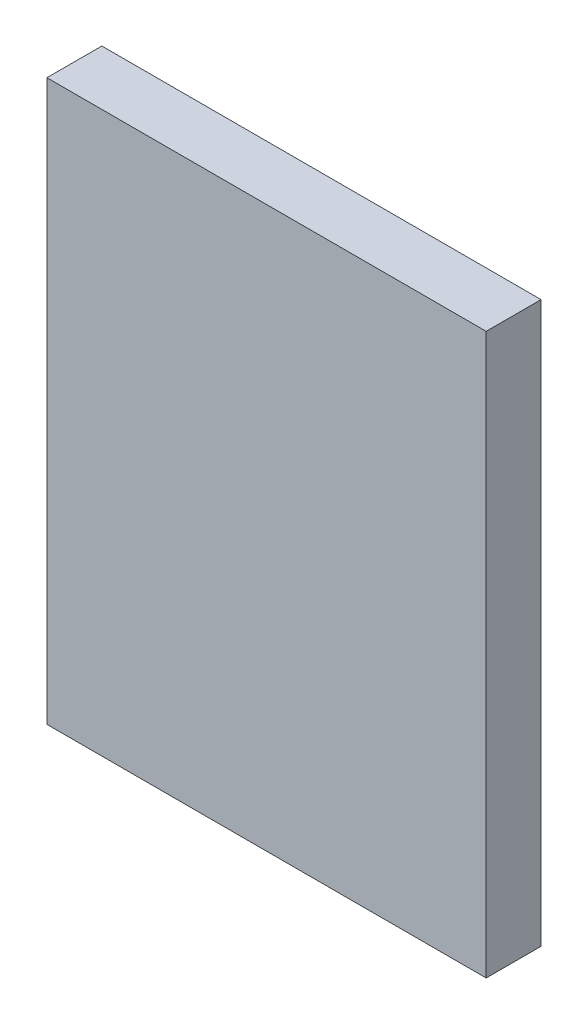
ISO-10303-21;
HEADER;
FILE_DESCRIPTION(('STEP AP214'),'2;1');
FILE_NAME('part.step','',(''),(''),'','','');
FILE_SCHEMA(('AUTOMOTIVE_DESIGN { 1 0 10303 214 1 1 1 1 }'));
ENDSEC;
DATA;
#1=APPLICATION_CONTEXT('core data for automotive mechanical design processes');
#2=APPLICATION_PROTOCOL_DEFINITION('international standard','automotive_design',2000,#1);
#3=PRODUCT_CONTEXT('',#1,'mechanical');
#4=PRODUCT('Part','Part','',(#3));
#5=PRODUCT_RELATED_PRODUCT_CATEGORY('part','',(#4));
#6=PRODUCT_DEFINITION_FORMATION('','',#4);
#7=PRODUCT_DEFINITION_CONTEXT('part definition',#1,'design');
#8=PRODUCT_DEFINITION('design','',#6,#7);
#9=PRODUCT_DEFINITION_SHAPE('','',#8);
#10=(LENGTH_UNIT() NAMED_UNIT(*) SI_UNIT(.MILLI.,.METRE.));
#11=(NAMED_UNIT(*) PLANE_ANGLE_UNIT() SI_UNIT($,.RADIAN.));
#12=(NAMED_UNIT(*) SI_UNIT($,.STERADIAN.) SOLID_ANGLE_UNIT());
#13=UNCERTAINTY_MEASURE_WITH_UNIT(LENGTH_MEASURE(1.E-05),#10,'distance_accuracy_value','');
#14=(GEOMETRIC_REPRESENTATION_CONTEXT(3) GLOBAL_UNCERTAINTY_ASSIGNED_CONTEXT((#13)) GLOBAL_UNIT_ASSIGNED_CONTEXT((#10,
#11,#12)) REPRESENTATION_CONTEXT('',''));
#15=CARTESIAN_POINT('',(0.,0.,0.));
#16=DIRECTION('',(0.,0.,1.));
#17=DIRECTION('',(1.,0.,0.));
#18=AXIS2_PLACEMENT_3D('',#15,#16,#17);
#19=CARTESIAN_POINT('',(20.,-25.5,5.));
#20=DIRECTION('',(-1.,0.,0.));
#21=DIRECTION('',(0.,0.,1.));
#22=AXIS2_PLACEMENT_3D('',#19,#20,#21);
#23=PLANE('',#22);
#24=DIRECTION('',(0.,1.,0.));
#25=VECTOR('',#24,1.);
#26=CARTESIAN_POINT('',(20.,-25.5,0.));
#27=LINE('',#26,#25);
#28=CARTESIAN_POINT('',(20.,-25.5,0.));
#29=VERTEX_POINT('',#28);
#30=CARTESIAN_POINT('',(20.,25.5,0.));
#31=VERTEX_POINT('',#30);
#32=EDGE_CURVE('E96',#29,#31,#27,.T.);
#33=ORIENTED_EDGE('',*,*,#32,.T.);
#34=DIRECTION('',(0.,0.,-1.));
#35=VECTOR('',#34,1.);
#36=CARTESIAN_POINT('',(20.,25.5,5.));
#37=LINE('',#36,#35);
#38=CARTESIAN_POINT('',(20.,25.5,5.));
#39=VERTEX_POINT('',#38);
#40=EDGE_CURVE('E11',#39,#31,#37,.T.);
#41=ORIENTED_EDGE('',*,*,#40,.F.);
#42=DIRECTION('',(0.,1.,0.));
#43=VECTOR('',#42,1.);
#44=CARTESIAN_POINT('',(20.,-25.5,5.));
#45=LINE('',#44,#43);
#46=CARTESIAN_POINT('',(20.,-25.5,5.));
#47=VERTEX_POINT('',#46);
#48=EDGE_CURVE('E84',#47,#39,#45,.T.);
#49=ORIENTED_EDGE('',*,*,#48,.F.);
#50=DIRECTION('',(0.,0.,-1.));
#51=VECTOR('',#50,1.);
#52=CARTESIAN_POINT('',(20.,-25.5,5.));
#53=LINE('',#52,#51);
#54=EDGE_CURVE('E92',#47,#29,#53,.T.);
#55=ORIENTED_EDGE('',*,*,#54,.T.);
#56=EDGE_LOOP('',(#33,#41,#49,#55));
#57=FACE_BOUND('',#56,.T.);
#58=ADVANCED_FACE('F33',(#57),#23,.F.);
#59=CARTESIAN_POINT('',(-20.,25.5,5.));
#60=DIRECTION('',(0.,-1.,0.));
#61=DIRECTION('',(0.,0.,-1.));
#62=AXIS2_PLACEMENT_3D('',#59,#60,#61);
#63=PLANE('',#62);
#64=DIRECTION('',(-1.,0.,0.));
#65=VECTOR('',#64,1.);
#66=CARTESIAN_POINT('',(-20.,25.5,0.));
#67=LINE('',#66,#65);
#68=CARTESIAN_POINT('',(-20.,25.5,0.));
#69=VERTEX_POINT('',#68);
#70=EDGE_CURVE('E88',#31,#69,#67,.T.);
#71=ORIENTED_EDGE('',*,*,#70,.T.);
#72=DIRECTION('',(0.,0.,-1.));
#73=VECTOR('',#72,1.);
#74=CARTESIAN_POINT('',(-20.,25.5,5.));
#75=LINE('',#74,#73);
#76=CARTESIAN_POINT('',(-20.,25.5,5.));
#77=VERTEX_POINT('',#76);
#78=EDGE_CURVE('E41',#77,#69,#75,.T.);
#79=ORIENTED_EDGE('',*,*,#78,.F.);
#80=DIRECTION('',(-1.,0.,0.));
#81=VECTOR('',#80,1.);
#82=CARTESIAN_POINT('',(-20.,25.5,5.));
#83=LINE('',#82,#81);
#84=EDGE_CURVE('E79',#39,#77,#83,.T.);
#85=ORIENTED_EDGE('',*,*,#84,.F.);
#86=ORIENTED_EDGE('',*,*,#40,.T.);
#87=EDGE_LOOP('',(#71,#79,#85,#86));
#88=FACE_BOUND('',#87,.T.);
#89=ADVANCED_FACE('F87',(#88),#63,.F.);
#90=CARTESIAN_POINT('',(-20.,-25.5,5.));
#91=DIRECTION('',(1.,0.,0.));
#92=DIRECTION('',(0.,0.,-1.));
#93=AXIS2_PLACEMENT_3D('',#90,#91,#92);
#94=PLANE('',#93);
#95=DIRECTION('',(0.,-1.,0.));
#96=VECTOR('',#95,1.);
#97=CARTESIAN_POINT('',(-20.,-25.5,0.));
#98=LINE('',#97,#96);
#99=CARTESIAN_POINT('',(-20.,-25.5,0.));
#100=VERTEX_POINT('',#99);
#101=EDGE_CURVE('E66',#69,#100,#98,.T.);
#102=ORIENTED_EDGE('',*,*,#101,.T.);
#103=DIRECTION('',(0.,0.,-1.));
#104=VECTOR('',#103,1.);
#105=CARTESIAN_POINT('',(-20.,-25.5,5.));
#106=LINE('',#105,#104);
#107=CARTESIAN_POINT('',(-20.,-25.5,5.));
#108=VERTEX_POINT('',#107);
#109=EDGE_CURVE('E89',#108,#100,#106,.T.);
#110=ORIENTED_EDGE('',*,*,#109,.F.);
#111=DIRECTION('',(0.,-1.,0.));
#112=VECTOR('',#111,1.);
#113=CARTESIAN_POINT('',(-20.,-25.5,5.));
#114=LINE('',#113,#112);
#115=EDGE_CURVE('E82',#77,#108,#114,.T.);
#116=ORIENTED_EDGE('',*,*,#115,.F.);
#117=ORIENTED_EDGE('',*,*,#78,.T.);
#118=EDGE_LOOP('',(#102,#110,#116,#117));
#119=FACE_BOUND('',#118,.T.);
#120=ADVANCED_FACE('F90',(#119),#94,.F.);
#121=CARTESIAN_POINT('',(-20.,-25.5,5.));
#122=DIRECTION('',(0.,1.,0.));
#123=DIRECTION('',(0.,0.,1.));
#124=AXIS2_PLACEMENT_3D('',#121,#122,#123);
#125=PLANE('',#124);
#126=DIRECTION('',(1.,0.,0.));
#127=VECTOR('',#126,1.);
#128=CARTESIAN_POINT('',(-20.,-25.5,0.));
#129=LINE('',#128,#127);
#130=EDGE_CURVE('E72',#100,#29,#129,.T.);
#131=ORIENTED_EDGE('',*,*,#130,.T.);
#132=ORIENTED_EDGE('',*,*,#54,.F.);
#133=DIRECTION('',(1.,0.,0.));
#134=VECTOR('',#133,1.);
#135=CARTESIAN_POINT('',(-20.,-25.5,5.));
#136=LINE('',#135,#134);
#137=EDGE_CURVE('E49',#108,#47,#136,.T.);
#138=ORIENTED_EDGE('',*,*,#137,.F.);
#139=ORIENTED_EDGE('',*,*,#109,.T.);
#140=EDGE_LOOP('',(#131,#132,#138,#139));
#141=FACE_BOUND('',#140,.T.);
#142=ADVANCED_FACE('F103',(#141),#125,.F.);
#143=CARTESIAN_POINT('',(0.,0.,5.));
#144=DIRECTION('',(0.,0.,-1.));
#145=DIRECTION('',(-1.,0.,0.));
#146=AXIS2_PLACEMENT_3D('',#143,#144,#145);
#147=PLANE('',#146);
#148=ORIENTED_EDGE('',*,*,#48,.T.);
#149=ORIENTED_EDGE('',*,*,#84,.T.);
#150=ORIENTED_EDGE('',*,*,#115,.T.);
#151=ORIENTED_EDGE('',*,*,#137,.T.);
#152=EDGE_LOOP('',(#148,#149,#150,#151));
#153=FACE_BOUND('',#152,.T.);
#154=ADVANCED_FACE('F80',(#153),#147,.F.);
#155=CARTESIAN_POINT('',(0.,0.,0.));
#156=DIRECTION('',(0.,0.,-1.));
#157=DIRECTION('',(-1.,0.,0.));
#158=AXIS2_PLACEMENT_3D('',#155,#156,#157);
#159=PLANE('',#158);
#160=ORIENTED_EDGE('',*,*,#32,.F.);
#161=ORIENTED_EDGE('',*,*,#130,.F.);
#162=ORIENTED_EDGE('',*,*,#101,.F.);
#163=ORIENTED_EDGE('',*,*,#70,.F.);
#164=EDGE_LOOP('',(#160,#161,#162,#163));
#165=FACE_BOUND('',#164,.T.);
#166=ADVANCED_FACE('F106',(#165),#159,.T.);
#167=CLOSED_SHELL('',(#58,#89,#120,#142,#154,#166));
#168=MANIFOLD_SOLID_BREP('B2',#167);
#169=ADVANCED_BREP_SHAPE_REPRESENTATION('',(#18,#168),#14);
#170=SHAPE_DEFINITION_REPRESENTATION(#9,#169);
ENDSEC;
END-ISO-10303-21;
